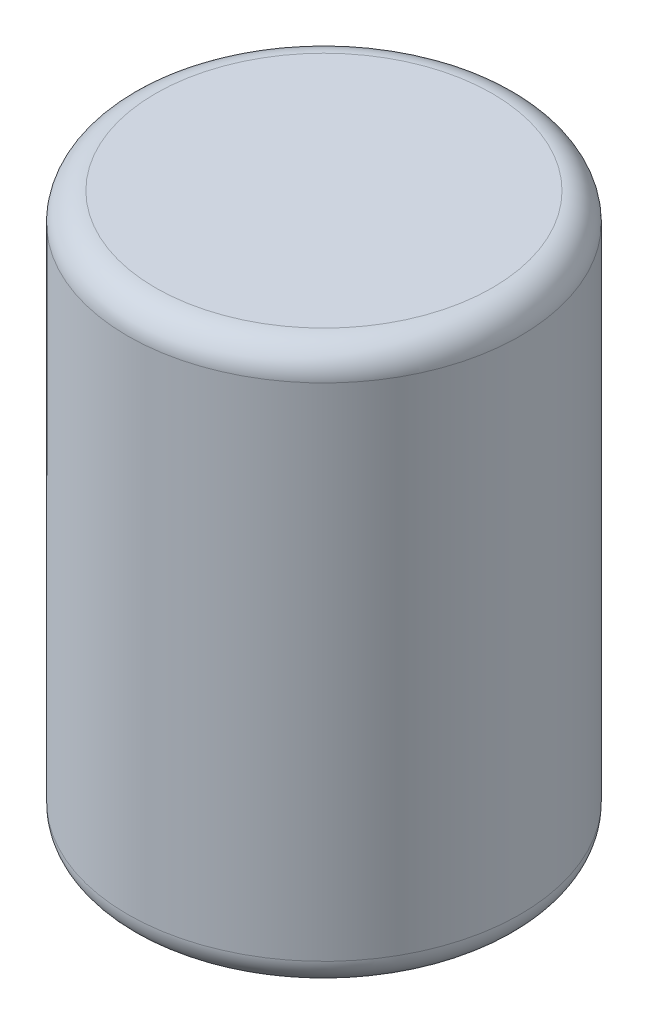
ISO-10303-21;
HEADER;
FILE_DESCRIPTION(('STEP AP214'),'2;1');
FILE_NAME('part.step','',(''),(''),'','','');
FILE_SCHEMA(('AUTOMOTIVE_DESIGN { 1 0 10303 214 1 1 1 1 }'));
ENDSEC;
DATA;
#1=APPLICATION_CONTEXT('core data for automotive mechanical design processes');
#2=APPLICATION_PROTOCOL_DEFINITION('international standard','automotive_design',2000,#1);
#3=PRODUCT_CONTEXT('',#1,'mechanical');
#4=PRODUCT('Part','Part','',(#3));
#5=PRODUCT_RELATED_PRODUCT_CATEGORY('part','',(#4));
#6=PRODUCT_DEFINITION_FORMATION('','',#4);
#7=PRODUCT_DEFINITION_CONTEXT('part definition',#1,'design');
#8=PRODUCT_DEFINITION('design','',#6,#7);
#9=PRODUCT_DEFINITION_SHAPE('','',#8);
#10=(LENGTH_UNIT() NAMED_UNIT(*) SI_UNIT(.MILLI.,.METRE.));
#11=(NAMED_UNIT(*) PLANE_ANGLE_UNIT() SI_UNIT($,.RADIAN.));
#12=(NAMED_UNIT(*) SI_UNIT($,.STERADIAN.) SOLID_ANGLE_UNIT());
#13=UNCERTAINTY_MEASURE_WITH_UNIT(LENGTH_MEASURE(1.E-05),#10,'distance_accuracy_value','');
#14=(GEOMETRIC_REPRESENTATION_CONTEXT(3) GLOBAL_UNCERTAINTY_ASSIGNED_CONTEXT((#13)) GLOBAL_UNIT_ASSIGNED_CONTEXT((#10,
#11,#12)) REPRESENTATION_CONTEXT('',''));
#15=CARTESIAN_POINT('',(0.,0.,0.));
#16=DIRECTION('',(0.,0.,1.));
#17=DIRECTION('',(1.,0.,0.));
#18=AXIS2_PLACEMENT_3D('',#15,#16,#17);
#19=CARTESIAN_POINT('',(0.,40.,0.));
#20=DIRECTION('',(0.,-1.,0.));
#21=DIRECTION('',(0.,0.,-1.));
#22=AXIS2_PLACEMENT_3D('',#19,#20,#21);
#23=CYLINDRICAL_SURFACE('',#22,14.1);
#24=CARTESIAN_POINT('',(0.,2.,0.));
#25=DIRECTION('',(0.,1.,0.));
#26=DIRECTION('',(0.,0.,1.));
#27=AXIS2_PLACEMENT_3D('',#24,#25,#26);
#28=CIRCLE('',#27,14.1);
#29=CARTESIAN_POINT('',(0.,2.,14.1));
#30=VERTEX_POINT('',#29);
#31=EDGE_CURVE('E42',#30,#30,#28,.T.);
#32=ORIENTED_EDGE('',*,*,#31,.T.);
#33=EDGE_LOOP('',(#32));
#34=FACE_BOUND('',#33,.T.);
#35=CARTESIAN_POINT('',(0.,38.,0.));
#36=DIRECTION('',(0.,1.,0.));
#37=DIRECTION('',(0.,0.,1.));
#38=AXIS2_PLACEMENT_3D('',#35,#36,#37);
#39=CIRCLE('',#38,14.1);
#40=CARTESIAN_POINT('',(0.,38.,14.1));
#41=VERTEX_POINT('',#40);
#42=EDGE_CURVE('E46',#41,#41,#39,.F.);
#43=ORIENTED_EDGE('',*,*,#42,.T.);
#44=EDGE_LOOP('',(#43));
#45=FACE_BOUND('',#44,.T.);
#46=ADVANCED_FACE('F31',(#34,#45),#23,.T.);
#47=CARTESIAN_POINT('',(0.,40.,0.));
#48=DIRECTION('',(0.,1.,0.));
#49=DIRECTION('',(0.,0.,1.));
#50=AXIS2_PLACEMENT_3D('',#47,#48,#49);
#51=PLANE('',#50);
#52=CARTESIAN_POINT('',(0.,40.,0.));
#53=DIRECTION('',(0.,1.,0.));
#54=DIRECTION('',(0.,0.,1.));
#55=AXIS2_PLACEMENT_3D('',#52,#53,#54);
#56=CIRCLE('',#55,12.1);
#57=CARTESIAN_POINT('',(0.,40.,12.1));
#58=VERTEX_POINT('',#57);
#59=EDGE_CURVE('E10',#58,#58,#56,.T.);
#60=ORIENTED_EDGE('',*,*,#59,.T.);
#61=EDGE_LOOP('',(#60));
#62=FACE_BOUND('',#61,.T.);
#63=ADVANCED_FACE('F62',(#62),#51,.T.);
#64=CARTESIAN_POINT('',(0.,0.,0.));
#65=DIRECTION('',(0.,1.,0.));
#66=DIRECTION('',(0.,0.,1.));
#67=AXIS2_PLACEMENT_3D('',#64,#65,#66);
#68=PLANE('',#67);
#69=CARTESIAN_POINT('',(0.,0.,0.));
#70=DIRECTION('',(0.,1.,0.));
#71=DIRECTION('',(0.,0.,1.));
#72=AXIS2_PLACEMENT_3D('',#69,#70,#71);
#73=CIRCLE('',#72,12.1);
#74=CARTESIAN_POINT('',(0.,0.,12.1));
#75=VERTEX_POINT('',#74);
#76=EDGE_CURVE('E38',#75,#75,#73,.F.);
#77=ORIENTED_EDGE('',*,*,#76,.T.);
#78=EDGE_LOOP('',(#77));
#79=FACE_BOUND('',#78,.T.);
#80=ADVANCED_FACE('F59',(#79),#68,.F.);
#81=CARTESIAN_POINT('',(0.,2.,0.));
#82=DIRECTION('',(0.,1.,0.));
#83=DIRECTION('',(0.,0.,1.));
#84=AXIS2_PLACEMENT_3D('',#81,#82,#83);
#85=TOROIDAL_SURFACE('',#84,12.1,2.);
#86=ORIENTED_EDGE('',*,*,#76,.F.);
#87=EDGE_LOOP('',(#86));
#88=FACE_BOUND('',#87,.T.);
#89=ORIENTED_EDGE('',*,*,#31,.F.);
#90=EDGE_LOOP('',(#89));
#91=FACE_BOUND('',#90,.T.);
#92=ADVANCED_FACE('F55',(#88,#91),#85,.T.);
#93=CARTESIAN_POINT('',(0.,38.,0.));
#94=DIRECTION('',(0.,1.,0.));
#95=DIRECTION('',(0.,0.,1.));
#96=AXIS2_PLACEMENT_3D('',#93,#94,#95);
#97=TOROIDAL_SURFACE('',#96,12.1,2.);
#98=ORIENTED_EDGE('',*,*,#42,.F.);
#99=EDGE_LOOP('',(#98));
#100=FACE_BOUND('',#99,.T.);
#101=ORIENTED_EDGE('',*,*,#59,.F.);
#102=EDGE_LOOP('',(#101));
#103=FACE_BOUND('',#102,.T.);
#104=ADVANCED_FACE('F33',(#100,#103),#97,.T.);
#105=CLOSED_SHELL('',(#46,#63,#80,#92,#104));
#106=MANIFOLD_SOLID_BREP('B2',#105);
#107=ADVANCED_BREP_SHAPE_REPRESENTATION('',(#18,#106),#14);
#108=SHAPE_DEFINITION_REPRESENTATION(#9,#107);
ENDSEC;
END-ISO-10303-21;
